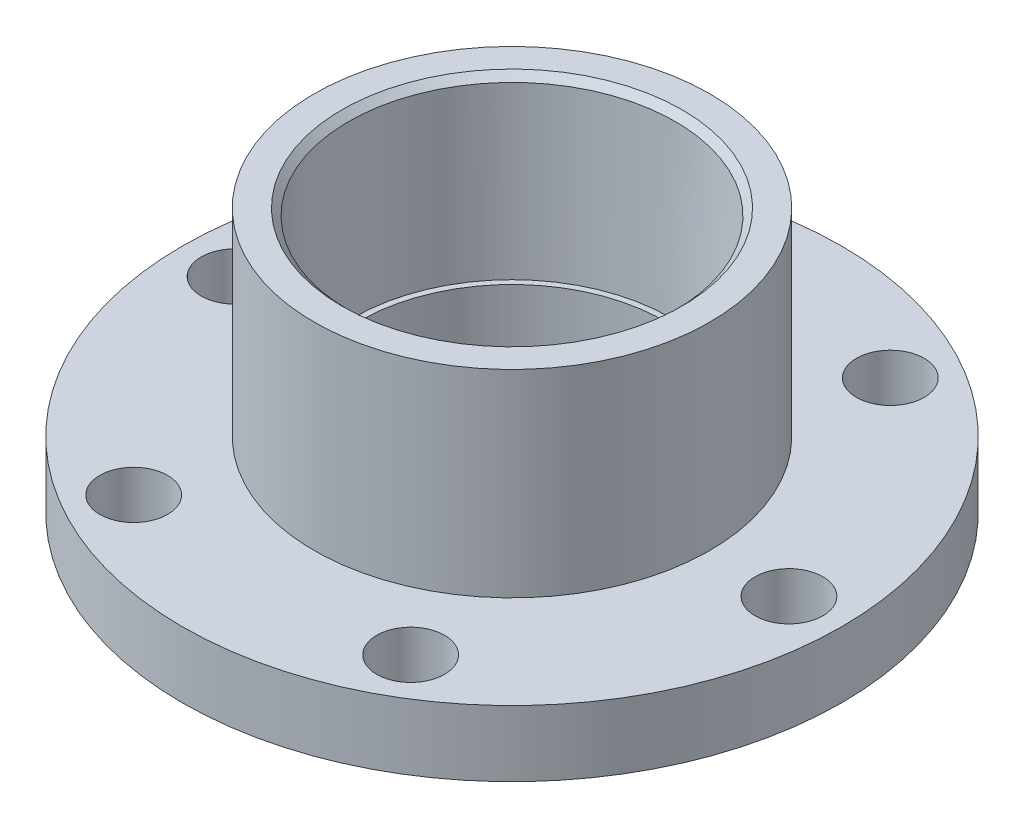
ISO-10303-21;
HEADER;
FILE_DESCRIPTION(('STEP AP214'),'2;1');
FILE_NAME('part.step','',(''),(''),'','','');
FILE_SCHEMA(('AUTOMOTIVE_DESIGN { 1 0 10303 214 1 1 1 1 }'));
ENDSEC;
DATA;
#1=APPLICATION_CONTEXT('core data for automotive mechanical design processes');
#2=APPLICATION_PROTOCOL_DEFINITION('international standard','automotive_design',2000,#1);
#3=PRODUCT_CONTEXT('',#1,'mechanical');
#4=PRODUCT('Part','Part','',(#3));
#5=PRODUCT_RELATED_PRODUCT_CATEGORY('part','',(#4));
#6=PRODUCT_DEFINITION_FORMATION('','',#4);
#7=PRODUCT_DEFINITION_CONTEXT('part definition',#1,'design');
#8=PRODUCT_DEFINITION('design','',#6,#7);
#9=PRODUCT_DEFINITION_SHAPE('','',#8);
#10=(LENGTH_UNIT() NAMED_UNIT(*) SI_UNIT(.MILLI.,.METRE.));
#11=(NAMED_UNIT(*) PLANE_ANGLE_UNIT() SI_UNIT($,.RADIAN.));
#12=(NAMED_UNIT(*) SI_UNIT($,.STERADIAN.) SOLID_ANGLE_UNIT());
#13=UNCERTAINTY_MEASURE_WITH_UNIT(LENGTH_MEASURE(1.E-05),#10,'distance_accuracy_value','');
#14=(GEOMETRIC_REPRESENTATION_CONTEXT(3) GLOBAL_UNCERTAINTY_ASSIGNED_CONTEXT((#13)) GLOBAL_UNIT_ASSIGNED_CONTEXT((#10,
#11,#12)) REPRESENTATION_CONTEXT('',''));
#15=CARTESIAN_POINT('',(0.,0.,0.));
#16=DIRECTION('',(0.,0.,1.));
#17=DIRECTION('',(1.,0.,0.));
#18=AXIS2_PLACEMENT_3D('',#15,#16,#17);
#19=CARTESIAN_POINT('',(0.,25.4,0.));
#20=DIRECTION('',(0.,1.,0.));
#21=DIRECTION('',(0.,0.,1.));
#22=AXIS2_PLACEMENT_3D('',#19,#20,#21);
#23=PLANE('',#22);
#24=CARTESIAN_POINT('',(0.,25.4,0.));
#25=DIRECTION('',(0.,1.,0.));
#26=DIRECTION('',(0.,0.,1.));
#27=AXIS2_PLACEMENT_3D('',#24,#25,#26);
#28=CIRCLE('',#27,16.383);
#29=CARTESIAN_POINT('',(0.,25.4,16.383));
#30=VERTEX_POINT('',#29);
#31=EDGE_CURVE('E103',#30,#30,#28,.T.);
#32=ORIENTED_EDGE('',*,*,#31,.F.);
#33=EDGE_LOOP('',(#32));
#34=FACE_BOUND('',#33,.T.);
#35=CARTESIAN_POINT('',(0.,25.4,0.));
#36=DIRECTION('',(0.,-1.,0.));
#37=DIRECTION('',(0.,0.,-1.));
#38=AXIS2_PLACEMENT_3D('',#35,#36,#37);
#39=CIRCLE('',#38,19.05);
#40=CARTESIAN_POINT('',(0.,25.4,-19.05));
#41=VERTEX_POINT('',#40);
#42=EDGE_CURVE('E10',#41,#41,#39,.T.);
#43=ORIENTED_EDGE('',*,*,#42,.F.);
#44=EDGE_LOOP('',(#43));
#45=FACE_BOUND('',#44,.T.);
#46=ADVANCED_FACE('F38',(#34,#45),#23,.T.);
#47=CARTESIAN_POINT('',(0.,0.,0.));
#48=DIRECTION('',(0.,-1.,0.));
#49=DIRECTION('',(0.,0.,-1.));
#50=AXIS2_PLACEMENT_3D('',#47,#48,#49);
#51=CYLINDRICAL_SURFACE('',#50,19.05);
#52=ORIENTED_EDGE('',*,*,#42,.T.);
#53=EDGE_LOOP('',(#52));
#54=FACE_BOUND('',#53,.T.);
#55=CARTESIAN_POINT('',(0.,6.35,0.));
#56=DIRECTION('',(0.,-1.,0.));
#57=DIRECTION('',(0.,0.,-1.));
#58=AXIS2_PLACEMENT_3D('',#55,#56,#57);
#59=CIRCLE('',#58,19.05);
#60=CARTESIAN_POINT('',(0.,6.35,-19.05));
#61=VERTEX_POINT('',#60);
#62=EDGE_CURVE('E45',#61,#61,#59,.T.);
#63=ORIENTED_EDGE('',*,*,#62,.F.);
#64=EDGE_LOOP('',(#63));
#65=FACE_BOUND('',#64,.T.);
#66=ADVANCED_FACE('F163',(#54,#65),#51,.T.);
#67=CARTESIAN_POINT('',(19.05,6.35,0.));
#68=DIRECTION('',(0.,1.,0.));
#69=DIRECTION('',(0.,0.,1.));
#70=AXIS2_PLACEMENT_3D('',#67,#68,#69);
#71=PLANE('',#70);
#72=CARTESIAN_POINT('',(13.3350000000003,6.35,-23.0968975189308));
#73=DIRECTION('',(0.,1.,0.));
#74=DIRECTION('',(0.,0.,1.));
#75=AXIS2_PLACEMENT_3D('',#72,#73,#74);
#76=CIRCLE('',#75,3.2639);
#77=CARTESIAN_POINT('',(13.3350000000003,6.35,-19.8329975189308));
#78=VERTEX_POINT('',#77);
#79=EDGE_CURVE('E151',#78,#78,#76,.T.);
#80=ORIENTED_EDGE('',*,*,#79,.F.);
#81=EDGE_LOOP('',(#80));
#82=FACE_BOUND('',#81,.T.);
#83=CARTESIAN_POINT('',(-13.3349999999998,6.35,-23.0968975189311));
#84=DIRECTION('',(0.,1.,0.));
#85=DIRECTION('',(0.,0.,1.));
#86=AXIS2_PLACEMENT_3D('',#83,#84,#85);
#87=CIRCLE('',#86,3.2639);
#88=CARTESIAN_POINT('',(-13.3349999999998,6.35,-19.8329975189311));
#89=VERTEX_POINT('',#88);
#90=EDGE_CURVE('E143',#89,#89,#87,.T.);
#91=ORIENTED_EDGE('',*,*,#90,.F.);
#92=EDGE_LOOP('',(#91));
#93=FACE_BOUND('',#92,.T.);
#94=CARTESIAN_POINT('',(-26.67,6.35,0.));
#95=DIRECTION('',(0.,1.,0.));
#96=DIRECTION('',(0.,0.,1.));
#97=AXIS2_PLACEMENT_3D('',#94,#95,#96);
#98=CIRCLE('',#97,3.2639);
#99=CARTESIAN_POINT('',(-26.67,6.35,3.2639));
#100=VERTEX_POINT('',#99);
#101=EDGE_CURVE('E135',#100,#100,#98,.T.);
#102=ORIENTED_EDGE('',*,*,#101,.F.);
#103=EDGE_LOOP('',(#102));
#104=FACE_BOUND('',#103,.T.);
#105=CARTESIAN_POINT('',(-13.3350000000001,6.35,23.0968975189309));
#106=DIRECTION('',(0.,1.,0.));
#107=DIRECTION('',(0.,0.,1.));
#108=AXIS2_PLACEMENT_3D('',#105,#106,#107);
#109=CIRCLE('',#108,3.2639);
#110=CARTESIAN_POINT('',(-13.3350000000001,6.35,26.3607975189309));
#111=VERTEX_POINT('',#110);
#112=EDGE_CURVE('E127',#111,#111,#109,.T.);
#113=ORIENTED_EDGE('',*,*,#112,.F.);
#114=EDGE_LOOP('',(#113));
#115=FACE_BOUND('',#114,.T.);
#116=CARTESIAN_POINT('',(13.3349999999999,6.35,23.096897518931));
#117=DIRECTION('',(0.,1.,0.));
#118=DIRECTION('',(0.,0.,1.));
#119=AXIS2_PLACEMENT_3D('',#116,#117,#118);
#120=CIRCLE('',#119,3.2639);
#121=CARTESIAN_POINT('',(13.3349999999999,6.35,26.360797518931));
#122=VERTEX_POINT('',#121);
#123=EDGE_CURVE('E119',#122,#122,#120,.T.);
#124=ORIENTED_EDGE('',*,*,#123,.F.);
#125=EDGE_LOOP('',(#124));
#126=FACE_BOUND('',#125,.T.);
#127=CARTESIAN_POINT('',(26.67,6.35,0.));
#128=DIRECTION('',(0.,1.,0.));
#129=DIRECTION('',(0.,0.,1.));
#130=AXIS2_PLACEMENT_3D('',#127,#128,#129);
#131=CIRCLE('',#130,3.2639);
#132=CARTESIAN_POINT('',(26.67,6.35,3.2639));
#133=VERTEX_POINT('',#132);
#134=EDGE_CURVE('E111',#133,#133,#131,.T.);
#135=ORIENTED_EDGE('',*,*,#134,.F.);
#136=EDGE_LOOP('',(#135));
#137=FACE_BOUND('',#136,.T.);
#138=ORIENTED_EDGE('',*,*,#62,.T.);
#139=EDGE_LOOP('',(#138));
#140=FACE_BOUND('',#139,.T.);
#141=CARTESIAN_POINT('',(0.,6.35,0.));
#142=DIRECTION('',(0.,-1.,0.));
#143=DIRECTION('',(0.,0.,-1.));
#144=AXIS2_PLACEMENT_3D('',#141,#142,#143);
#145=CIRCLE('',#144,31.75);
#146=CARTESIAN_POINT('',(0.,6.35,-31.75));
#147=VERTEX_POINT('',#146);
#148=EDGE_CURVE('E51',#147,#147,#145,.T.);
#149=ORIENTED_EDGE('',*,*,#148,.F.);
#150=EDGE_LOOP('',(#149));
#151=FACE_BOUND('',#150,.T.);
#152=ADVANCED_FACE('F159',(#82,#93,#104,#115,#126,#137,#140,#151),#71,.T.);
#153=CARTESIAN_POINT('',(0.,0.,0.));
#154=DIRECTION('',(0.,-1.,0.));
#155=DIRECTION('',(0.,0.,-1.));
#156=AXIS2_PLACEMENT_3D('',#153,#154,#155);
#157=CYLINDRICAL_SURFACE('',#156,31.75);
#158=ORIENTED_EDGE('',*,*,#148,.T.);
#159=EDGE_LOOP('',(#158));
#160=FACE_BOUND('',#159,.T.);
#161=CARTESIAN_POINT('',(0.,0.,0.));
#162=DIRECTION('',(0.,-1.,0.));
#163=DIRECTION('',(0.,0.,-1.));
#164=AXIS2_PLACEMENT_3D('',#161,#162,#163);
#165=CIRCLE('',#164,31.75);
#166=CARTESIAN_POINT('',(0.,0.,-31.75));
#167=VERTEX_POINT('',#166);
#168=EDGE_CURVE('E57',#167,#167,#165,.T.);
#169=ORIENTED_EDGE('',*,*,#168,.F.);
#170=EDGE_LOOP('',(#169));
#171=FACE_BOUND('',#170,.T.);
#172=ADVANCED_FACE('F162',(#160,#171),#157,.T.);
#173=CARTESIAN_POINT('',(31.75,0.,0.));
#174=DIRECTION('',(0.,-1.,0.));
#175=DIRECTION('',(0.,0.,-1.));
#176=AXIS2_PLACEMENT_3D('',#173,#174,#175);
#177=PLANE('',#176);
#178=CARTESIAN_POINT('',(13.3350000000003,0.,-23.0968975189308));
#179=DIRECTION('',(0.,1.,0.));
#180=DIRECTION('',(0.,0.,1.));
#181=AXIS2_PLACEMENT_3D('',#178,#179,#180);
#182=CIRCLE('',#181,3.2639);
#183=CARTESIAN_POINT('',(13.3350000000003,0.,-19.8329975189308));
#184=VERTEX_POINT('',#183);
#185=EDGE_CURVE('E147',#184,#184,#182,.T.);
#186=ORIENTED_EDGE('',*,*,#185,.T.);
#187=EDGE_LOOP('',(#186));
#188=FACE_BOUND('',#187,.T.);
#189=CARTESIAN_POINT('',(-13.3349999999998,0.,-23.0968975189311));
#190=DIRECTION('',(0.,1.,0.));
#191=DIRECTION('',(0.,0.,1.));
#192=AXIS2_PLACEMENT_3D('',#189,#190,#191);
#193=CIRCLE('',#192,3.2639);
#194=CARTESIAN_POINT('',(-13.3349999999998,0.,-19.8329975189311));
#195=VERTEX_POINT('',#194);
#196=EDGE_CURVE('E139',#195,#195,#193,.T.);
#197=ORIENTED_EDGE('',*,*,#196,.T.);
#198=EDGE_LOOP('',(#197));
#199=FACE_BOUND('',#198,.T.);
#200=CARTESIAN_POINT('',(-26.67,0.,0.));
#201=DIRECTION('',(0.,1.,0.));
#202=DIRECTION('',(0.,0.,1.));
#203=AXIS2_PLACEMENT_3D('',#200,#201,#202);
#204=CIRCLE('',#203,3.2639);
#205=CARTESIAN_POINT('',(-26.67,0.,3.2639));
#206=VERTEX_POINT('',#205);
#207=EDGE_CURVE('E131',#206,#206,#204,.T.);
#208=ORIENTED_EDGE('',*,*,#207,.T.);
#209=EDGE_LOOP('',(#208));
#210=FACE_BOUND('',#209,.T.);
#211=CARTESIAN_POINT('',(-13.3350000000001,0.,23.0968975189309));
#212=DIRECTION('',(0.,1.,0.));
#213=DIRECTION('',(0.,0.,1.));
#214=AXIS2_PLACEMENT_3D('',#211,#212,#213);
#215=CIRCLE('',#214,3.2639);
#216=CARTESIAN_POINT('',(-13.3350000000001,0.,26.3607975189309));
#217=VERTEX_POINT('',#216);
#218=EDGE_CURVE('E123',#217,#217,#215,.T.);
#219=ORIENTED_EDGE('',*,*,#218,.T.);
#220=EDGE_LOOP('',(#219));
#221=FACE_BOUND('',#220,.T.);
#222=CARTESIAN_POINT('',(13.3349999999999,0.,23.096897518931));
#223=DIRECTION('',(0.,1.,0.));
#224=DIRECTION('',(0.,0.,1.));
#225=AXIS2_PLACEMENT_3D('',#222,#223,#224);
#226=CIRCLE('',#225,3.2639);
#227=CARTESIAN_POINT('',(13.3349999999999,0.,26.360797518931));
#228=VERTEX_POINT('',#227);
#229=EDGE_CURVE('E115',#228,#228,#226,.T.);
#230=ORIENTED_EDGE('',*,*,#229,.T.);
#231=EDGE_LOOP('',(#230));
#232=FACE_BOUND('',#231,.T.);
#233=CARTESIAN_POINT('',(26.67,0.,0.));
#234=DIRECTION('',(0.,1.,0.));
#235=DIRECTION('',(0.,0.,1.));
#236=AXIS2_PLACEMENT_3D('',#233,#234,#235);
#237=CIRCLE('',#236,3.2639);
#238=CARTESIAN_POINT('',(26.67,0.,3.2639));
#239=VERTEX_POINT('',#238);
#240=EDGE_CURVE('E107',#239,#239,#237,.T.);
#241=ORIENTED_EDGE('',*,*,#240,.T.);
#242=EDGE_LOOP('',(#241));
#243=FACE_BOUND('',#242,.T.);
#244=ORIENTED_EDGE('',*,*,#168,.T.);
#245=EDGE_LOOP('',(#244));
#246=FACE_BOUND('',#245,.T.);
#247=CARTESIAN_POINT('',(0.,0.,0.));
#248=DIRECTION('',(0.,-1.,0.));
#249=DIRECTION('',(0.,0.,-1.));
#250=AXIS2_PLACEMENT_3D('',#247,#248,#249);
#251=CIRCLE('',#250,21.5773);
#252=CARTESIAN_POINT('',(0.,0.,-21.5773));
#253=VERTEX_POINT('',#252);
#254=EDGE_CURVE('E63',#253,#253,#251,.T.);
#255=ORIENTED_EDGE('',*,*,#254,.F.);
#256=EDGE_LOOP('',(#255));
#257=FACE_BOUND('',#256,.T.);
#258=ADVANCED_FACE('F179',(#188,#199,#210,#221,#232,#243,#246,#257),#177,.T.);
#259=CARTESIAN_POINT('',(0.,0.,0.));
#260=DIRECTION('',(0.,-1.,0.));
#261=DIRECTION('',(0.,0.,-1.));
#262=AXIS2_PLACEMENT_3D('',#259,#260,#261);
#263=CYLINDRICAL_SURFACE('',#262,21.5773);
#264=ORIENTED_EDGE('',*,*,#254,.T.);
#265=EDGE_LOOP('',(#264));
#266=FACE_BOUND('',#265,.T.);
#267=CARTESIAN_POINT('',(0.,2.2606,0.));
#268=DIRECTION('',(0.,-1.,0.));
#269=DIRECTION('',(0.,0.,-1.));
#270=AXIS2_PLACEMENT_3D('',#267,#268,#269);
#271=CIRCLE('',#270,21.5773);
#272=CARTESIAN_POINT('',(0.,2.2606,-21.5773));
#273=VERTEX_POINT('',#272);
#274=EDGE_CURVE('E67',#273,#273,#271,.T.);
#275=ORIENTED_EDGE('',*,*,#274,.F.);
#276=EDGE_LOOP('',(#275));
#277=FACE_BOUND('',#276,.T.);
#278=ADVANCED_FACE('F185',(#266,#277),#263,.F.);
#279=CARTESIAN_POINT('',(0.,2.2606,0.));
#280=DIRECTION('',(0.,-1.,0.));
#281=DIRECTION('',(0.,0.,-1.));
#282=AXIS2_PLACEMENT_3D('',#279,#280,#281);
#283=TOROIDAL_SURFACE('',#282,21.1963,0.381);
#284=ORIENTED_EDGE('',*,*,#274,.T.);
#285=EDGE_LOOP('',(#284));
#286=FACE_BOUND('',#285,.T.);
#287=CARTESIAN_POINT('',(0.,2.6416,0.));
#288=DIRECTION('',(0.,-1.,0.));
#289=DIRECTION('',(0.,0.,-1.));
#290=AXIS2_PLACEMENT_3D('',#287,#288,#289);
#291=CIRCLE('',#290,21.1963);
#292=CARTESIAN_POINT('',(0.,2.6416,-21.1963));
#293=VERTEX_POINT('',#292);
#294=EDGE_CURVE('E71',#293,#293,#291,.T.);
#295=ORIENTED_EDGE('',*,*,#294,.F.);
#296=EDGE_LOOP('',(#295));
#297=FACE_BOUND('',#296,.T.);
#298=ADVANCED_FACE('F192',(#286,#297),#283,.F.);
#299=CARTESIAN_POINT('',(17.3355,2.6416,0.));
#300=DIRECTION('',(0.,-1.,0.));
#301=DIRECTION('',(0.,0.,-1.));
#302=AXIS2_PLACEMENT_3D('',#299,#300,#301);
#303=PLANE('',#302);
#304=ORIENTED_EDGE('',*,*,#294,.T.);
#305=EDGE_LOOP('',(#304));
#306=FACE_BOUND('',#305,.T.);
#307=CARTESIAN_POINT('',(0.,2.6416,0.));
#308=DIRECTION('',(0.,-1.,0.));
#309=DIRECTION('',(0.,0.,-1.));
#310=AXIS2_PLACEMENT_3D('',#307,#308,#309);
#311=CIRCLE('',#310,17.3355);
#312=CARTESIAN_POINT('',(0.,2.6416,-17.3355));
#313=VERTEX_POINT('',#312);
#314=EDGE_CURVE('E75',#313,#313,#311,.T.);
#315=ORIENTED_EDGE('',*,*,#314,.F.);
#316=EDGE_LOOP('',(#315));
#317=FACE_BOUND('',#316,.T.);
#318=ADVANCED_FACE('F198',(#306,#317),#303,.T.);
#319=CARTESIAN_POINT('',(0.,2.2606,0.));
#320=DIRECTION('',(0.,-1.,0.));
#321=DIRECTION('',(0.,0.,-1.));
#322=AXIS2_PLACEMENT_3D('',#319,#320,#321);
#323=TOROIDAL_SURFACE('',#322,17.3355,0.381);
#324=ORIENTED_EDGE('',*,*,#314,.T.);
#325=EDGE_LOOP('',(#324));
#326=FACE_BOUND('',#325,.T.);
#327=CARTESIAN_POINT('',(0.,2.2606,0.));
#328=DIRECTION('',(0.,-1.,0.));
#329=DIRECTION('',(0.,0.,-1.));
#330=AXIS2_PLACEMENT_3D('',#327,#328,#329);
#331=CIRCLE('',#330,16.9545);
#332=CARTESIAN_POINT('',(0.,2.2606,-16.9545));
#333=VERTEX_POINT('',#332);
#334=EDGE_CURVE('E79',#333,#333,#331,.T.);
#335=ORIENTED_EDGE('',*,*,#334,.F.);
#336=EDGE_LOOP('',(#335));
#337=FACE_BOUND('',#336,.T.);
#338=ADVANCED_FACE('F204',(#326,#337),#323,.F.);
#339=CARTESIAN_POINT('',(0.,0.,0.));
#340=DIRECTION('',(0.,-1.,0.));
#341=DIRECTION('',(0.,0.,-1.));
#342=AXIS2_PLACEMENT_3D('',#339,#340,#341);
#343=CYLINDRICAL_SURFACE('',#342,16.9545);
#344=ORIENTED_EDGE('',*,*,#334,.T.);
#345=EDGE_LOOP('',(#344));
#346=FACE_BOUND('',#345,.T.);
#347=CARTESIAN_POINT('',(0.,0.,0.));
#348=DIRECTION('',(0.,-1.,0.));
#349=DIRECTION('',(0.,0.,-1.));
#350=AXIS2_PLACEMENT_3D('',#347,#348,#349);
#351=CIRCLE('',#350,16.9545);
#352=CARTESIAN_POINT('',(0.,0.,-16.9545));
#353=VERTEX_POINT('',#352);
#354=EDGE_CURVE('E83',#353,#353,#351,.T.);
#355=ORIENTED_EDGE('',*,*,#354,.F.);
#356=EDGE_LOOP('',(#355));
#357=FACE_BOUND('',#356,.T.);
#358=ADVANCED_FACE('F210',(#346,#357),#343,.T.);
#359=CARTESIAN_POINT('',(16.9545,0.,0.));
#360=DIRECTION('',(0.,-1.,0.));
#361=DIRECTION('',(0.,0.,-1.));
#362=AXIS2_PLACEMENT_3D('',#359,#360,#361);
#363=PLANE('',#362);
#364=CARTESIAN_POINT('',(0.,0.,0.));
#365=DIRECTION('',(0.,1.,0.));
#366=DIRECTION('',(0.,0.,1.));
#367=AXIS2_PLACEMENT_3D('',#364,#365,#366);
#368=CIRCLE('',#367,14.684375);
#369=CARTESIAN_POINT('',(0.,0.,14.684375));
#370=VERTEX_POINT('',#369);
#371=EDGE_CURVE('E87',#370,#370,#368,.T.);
#372=ORIENTED_EDGE('',*,*,#371,.T.);
#373=EDGE_LOOP('',(#372));
#374=FACE_BOUND('',#373,.T.);
#375=ORIENTED_EDGE('',*,*,#354,.T.);
#376=EDGE_LOOP('',(#375));
#377=FACE_BOUND('',#376,.T.);
#378=ADVANCED_FACE('F216',(#374,#377),#363,.T.);
#379=CARTESIAN_POINT('',(0.,25.4,0.));
#380=DIRECTION('',(0.,1.,0.));
#381=DIRECTION('',(0.,0.,1.));
#382=AXIS2_PLACEMENT_3D('',#379,#380,#381);
#383=CYLINDRICAL_SURFACE('',#382,14.684375);
#384=ORIENTED_EDGE('',*,*,#371,.F.);
#385=EDGE_LOOP('',(#384));
#386=FACE_BOUND('',#385,.T.);
#387=CARTESIAN_POINT('',(0.,8.636,0.));
#388=DIRECTION('',(0.,1.,0.));
#389=DIRECTION('',(0.,0.,1.));
#390=AXIS2_PLACEMENT_3D('',#387,#388,#389);
#391=CIRCLE('',#390,14.684375);
#392=CARTESIAN_POINT('',(0.,8.636,14.684375));
#393=VERTEX_POINT('',#392);
#394=EDGE_CURVE('E91',#393,#393,#391,.T.);
#395=ORIENTED_EDGE('',*,*,#394,.T.);
#396=EDGE_LOOP('',(#395));
#397=FACE_BOUND('',#396,.T.);
#398=ADVANCED_FACE('F221',(#386,#397),#383,.F.);
#399=CARTESIAN_POINT('',(14.684375,8.636,0.));
#400=DIRECTION('',(0.,-1.,0.));
#401=DIRECTION('',(0.,0.,-1.));
#402=AXIS2_PLACEMENT_3D('',#399,#400,#401);
#403=PLANE('',#402);
#404=ORIENTED_EDGE('',*,*,#394,.F.);
#405=EDGE_LOOP('',(#404));
#406=FACE_BOUND('',#405,.T.);
#407=CARTESIAN_POINT('',(0.,8.636,0.));
#408=DIRECTION('',(0.,1.,0.));
#409=DIRECTION('',(0.,0.,1.));
#410=AXIS2_PLACEMENT_3D('',#407,#408,#409);
#411=CIRCLE('',#410,15.2475328236491);
#412=CARTESIAN_POINT('',(0.,8.636,15.2475328236491));
#413=VERTEX_POINT('',#412);
#414=EDGE_CURVE('E95',#413,#413,#411,.T.);
#415=ORIENTED_EDGE('',*,*,#414,.T.);
#416=EDGE_LOOP('',(#415));
#417=FACE_BOUND('',#416,.T.);
#418=ADVANCED_FACE('F227',(#406,#417),#403,.F.);
#419=CARTESIAN_POINT('',(0.,24.7469152,0.));
#420=DIRECTION('',(0.,1.,0.));
#421=DIRECTION('',(0.,0.,1.));
#422=AXIS2_PLACEMENT_3D('',#419,#420,#421);
#423=CONICAL_SURFACE('',#422,15.7299152,0.029932396671703);
#424=ORIENTED_EDGE('',*,*,#414,.F.);
#425=EDGE_LOOP('',(#424));
#426=FACE_BOUND('',#425,.T.);
#427=CARTESIAN_POINT('',(0.,24.7469152,0.));
#428=DIRECTION('',(0.,1.,0.));
#429=DIRECTION('',(0.,0.,1.));
#430=AXIS2_PLACEMENT_3D('',#427,#428,#429);
#431=CIRCLE('',#430,15.7299152);
#432=CARTESIAN_POINT('',(0.,24.7469152,15.7299152));
#433=VERTEX_POINT('',#432);
#434=EDGE_CURVE('E99',#433,#433,#431,.T.);
#435=ORIENTED_EDGE('',*,*,#434,.T.);
#436=EDGE_LOOP('',(#435));
#437=FACE_BOUND('',#436,.T.);
#438=ADVANCED_FACE('F241',(#426,#437),#423,.F.);
#439=CARTESIAN_POINT('',(0.,25.4,0.));
#440=DIRECTION('',(0.,1.,0.));
#441=DIRECTION('',(0.,0.,1.));
#442=AXIS2_PLACEMENT_3D('',#439,#440,#441);
#443=CONICAL_SURFACE('',#442,16.383,0.785398163397448);
#444=ORIENTED_EDGE('',*,*,#434,.F.);
#445=EDGE_LOOP('',(#444));
#446=FACE_BOUND('',#445,.T.);
#447=ORIENTED_EDGE('',*,*,#31,.T.);
#448=EDGE_LOOP('',(#447));
#449=FACE_BOUND('',#448,.T.);
#450=ADVANCED_FACE('F238',(#446,#449),#443,.F.);
#451=CARTESIAN_POINT('',(26.67,6.35,0.));
#452=DIRECTION('',(0.,1.,0.));
#453=DIRECTION('',(0.,0.,1.));
#454=AXIS2_PLACEMENT_3D('',#451,#452,#453);
#455=CYLINDRICAL_SURFACE('',#454,3.2639);
#456=ORIENTED_EDGE('',*,*,#240,.F.);
#457=EDGE_LOOP('',(#456));
#458=FACE_BOUND('',#457,.T.);
#459=ORIENTED_EDGE('',*,*,#134,.T.);
#460=EDGE_LOOP('',(#459));
#461=FACE_BOUND('',#460,.T.);
#462=ADVANCED_FACE('F240',(#458,#461),#455,.F.);
#463=CARTESIAN_POINT('',(13.3349999999999,6.35,23.096897518931));
#464=DIRECTION('',(0.,1.,0.));
#465=DIRECTION('',(0.,0.,1.));
#466=AXIS2_PLACEMENT_3D('',#463,#464,#465);
#467=CYLINDRICAL_SURFACE('',#466,3.2639);
#468=ORIENTED_EDGE('',*,*,#229,.F.);
#469=EDGE_LOOP('',(#468));
#470=FACE_BOUND('',#469,.T.);
#471=ORIENTED_EDGE('',*,*,#123,.T.);
#472=EDGE_LOOP('',(#471));
#473=FACE_BOUND('',#472,.T.);
#474=ADVANCED_FACE('F248',(#470,#473),#467,.F.);
#475=CARTESIAN_POINT('',(-13.3350000000001,6.35,23.0968975189309));
#476=DIRECTION('',(0.,1.,0.));
#477=DIRECTION('',(0.,0.,1.));
#478=AXIS2_PLACEMENT_3D('',#475,#476,#477);
#479=CYLINDRICAL_SURFACE('',#478,3.2639);
#480=ORIENTED_EDGE('',*,*,#218,.F.);
#481=EDGE_LOOP('',(#480));
#482=FACE_BOUND('',#481,.T.);
#483=ORIENTED_EDGE('',*,*,#112,.T.);
#484=EDGE_LOOP('',(#483));
#485=FACE_BOUND('',#484,.T.);
#486=ADVANCED_FACE('F293',(#482,#485),#479,.F.);
#487=CARTESIAN_POINT('',(-26.67,6.35,0.));
#488=DIRECTION('',(0.,1.,0.));
#489=DIRECTION('',(0.,0.,1.));
#490=AXIS2_PLACEMENT_3D('',#487,#488,#489);
#491=CYLINDRICAL_SURFACE('',#490,3.2639);
#492=ORIENTED_EDGE('',*,*,#207,.F.);
#493=EDGE_LOOP('',(#492));
#494=FACE_BOUND('',#493,.T.);
#495=ORIENTED_EDGE('',*,*,#101,.T.);
#496=EDGE_LOOP('',(#495));
#497=FACE_BOUND('',#496,.T.);
#498=ADVANCED_FACE('F303',(#494,#497),#491,.F.);
#499=CARTESIAN_POINT('',(-13.3349999999998,6.35,-23.0968975189311));
#500=DIRECTION('',(0.,1.,0.));
#501=DIRECTION('',(0.,0.,1.));
#502=AXIS2_PLACEMENT_3D('',#499,#500,#501);
#503=CYLINDRICAL_SURFACE('',#502,3.2639);
#504=ORIENTED_EDGE('',*,*,#196,.F.);
#505=EDGE_LOOP('',(#504));
#506=FACE_BOUND('',#505,.T.);
#507=ORIENTED_EDGE('',*,*,#90,.T.);
#508=EDGE_LOOP('',(#507));
#509=FACE_BOUND('',#508,.T.);
#510=ADVANCED_FACE('F313',(#506,#509),#503,.F.);
#511=CARTESIAN_POINT('',(13.3350000000003,6.35,-23.0968975189308));
#512=DIRECTION('',(0.,1.,0.));
#513=DIRECTION('',(0.,0.,1.));
#514=AXIS2_PLACEMENT_3D('',#511,#512,#513);
#515=CYLINDRICAL_SURFACE('',#514,3.2639);
#516=ORIENTED_EDGE('',*,*,#185,.F.);
#517=EDGE_LOOP('',(#516));
#518=FACE_BOUND('',#517,.T.);
#519=ORIENTED_EDGE('',*,*,#79,.T.);
#520=EDGE_LOOP('',(#519));
#521=FACE_BOUND('',#520,.T.);
#522=ADVANCED_FACE('F157',(#518,#521),#515,.F.);
#523=CLOSED_SHELL('',(#46,#66,#152,#172,#258,#278,#298,#318,#338,#358,#378,#398,#418,#438,#450,
#462,#474,#486,#498,#510,#522));
#524=MANIFOLD_SOLID_BREP('B2',#523);
#525=ADVANCED_BREP_SHAPE_REPRESENTATION('',(#18,#524),#14);
#526=SHAPE_DEFINITION_REPRESENTATION(#9,#525);
ENDSEC;
END-ISO-10303-21;
